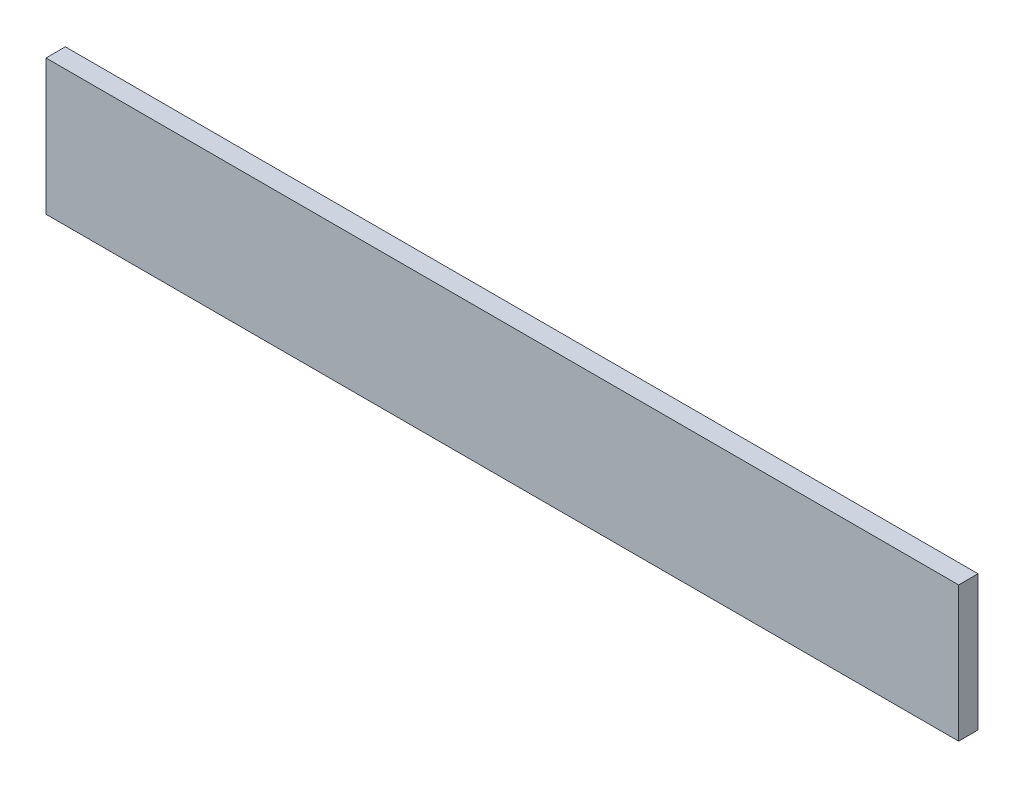
ISO-10303-21;
HEADER;
FILE_DESCRIPTION(('STEP AP214'),'2;1');
FILE_NAME('part.step','',(''),(''),'','','');
FILE_SCHEMA(('AUTOMOTIVE_DESIGN { 1 0 10303 214 1 1 1 1 }'));
ENDSEC;
DATA;
#1=APPLICATION_CONTEXT('core data for automotive mechanical design processes');
#2=APPLICATION_PROTOCOL_DEFINITION('international standard','automotive_design',2000,#1);
#3=PRODUCT_CONTEXT('',#1,'mechanical');
#4=PRODUCT('Part','Part','',(#3));
#5=PRODUCT_RELATED_PRODUCT_CATEGORY('part','',(#4));
#6=PRODUCT_DEFINITION_FORMATION('','',#4);
#7=PRODUCT_DEFINITION_CONTEXT('part definition',#1,'design');
#8=PRODUCT_DEFINITION('design','',#6,#7);
#9=PRODUCT_DEFINITION_SHAPE('','',#8);
#10=(LENGTH_UNIT() NAMED_UNIT(*) SI_UNIT(.MILLI.,.METRE.));
#11=(NAMED_UNIT(*) PLANE_ANGLE_UNIT() SI_UNIT($,.RADIAN.));
#12=(NAMED_UNIT(*) SI_UNIT($,.STERADIAN.) SOLID_ANGLE_UNIT());
#13=UNCERTAINTY_MEASURE_WITH_UNIT(LENGTH_MEASURE(1.E-05),#10,'distance_accuracy_value','');
#14=(GEOMETRIC_REPRESENTATION_CONTEXT(3) GLOBAL_UNCERTAINTY_ASSIGNED_CONTEXT((#13)) GLOBAL_UNIT_ASSIGNED_CONTEXT((#10,
#11,#12)) REPRESENTATION_CONTEXT('',''));
#15=CARTESIAN_POINT('',(0.,0.,0.));
#16=DIRECTION('',(0.,0.,1.));
#17=DIRECTION('',(1.,0.,0.));
#18=AXIS2_PLACEMENT_3D('',#15,#16,#17);
#19=CARTESIAN_POINT('',(236.,35.,-10.));
#20=DIRECTION('',(1.,0.,0.));
#21=DIRECTION('',(0.,0.,-1.));
#22=AXIS2_PLACEMENT_3D('',#19,#20,#21);
#23=PLANE('',#22);
#24=DIRECTION('',(0.,1.,0.));
#25=VECTOR('',#24,1.);
#26=CARTESIAN_POINT('',(236.,35.,0.));
#27=LINE('',#26,#25);
#28=CARTESIAN_POINT('',(236.,-35.,0.));
#29=VERTEX_POINT('',#28);
#30=CARTESIAN_POINT('',(236.,35.,0.));
#31=VERTEX_POINT('',#30);
#32=EDGE_CURVE('E102',#29,#31,#27,.T.);
#33=ORIENTED_EDGE('',*,*,#32,.F.);
#34=DIRECTION('',(0.,0.,1.));
#35=VECTOR('',#34,1.);
#36=CARTESIAN_POINT('',(236.,-35.,-10.));
#37=LINE('',#36,#35);
#38=CARTESIAN_POINT('',(236.,-35.,-10.));
#39=VERTEX_POINT('',#38);
#40=EDGE_CURVE('E11',#39,#29,#37,.T.);
#41=ORIENTED_EDGE('',*,*,#40,.F.);
#42=DIRECTION('',(0.,1.,0.));
#43=VECTOR('',#42,1.);
#44=CARTESIAN_POINT('',(236.,35.,-10.));
#45=LINE('',#44,#43);
#46=CARTESIAN_POINT('',(236.,35.,-10.));
#47=VERTEX_POINT('',#46);
#48=EDGE_CURVE('E96',#39,#47,#45,.T.);
#49=ORIENTED_EDGE('',*,*,#48,.T.);
#50=DIRECTION('',(0.,0.,1.));
#51=VECTOR('',#50,1.);
#52=CARTESIAN_POINT('',(236.,35.,-10.));
#53=LINE('',#52,#51);
#54=EDGE_CURVE('E41',#47,#31,#53,.T.);
#55=ORIENTED_EDGE('',*,*,#54,.T.);
#56=EDGE_LOOP('',(#33,#41,#49,#55));
#57=FACE_BOUND('',#56,.T.);
#58=ADVANCED_FACE('F38',(#57),#23,.T.);
#59=CARTESIAN_POINT('',(-236.,-35.,-10.));
#60=DIRECTION('',(0.,-1.,0.));
#61=DIRECTION('',(0.,0.,-1.));
#62=AXIS2_PLACEMENT_3D('',#59,#60,#61);
#63=PLANE('',#62);
#64=DIRECTION('',(1.,0.,0.));
#65=VECTOR('',#64,1.);
#66=CARTESIAN_POINT('',(-236.,-35.,0.));
#67=LINE('',#66,#65);
#68=CARTESIAN_POINT('',(-236.,-35.,0.));
#69=VERTEX_POINT('',#68);
#70=EDGE_CURVE('E98',#69,#29,#67,.T.);
#71=ORIENTED_EDGE('',*,*,#70,.F.);
#72=DIRECTION('',(0.,0.,1.));
#73=VECTOR('',#72,1.);
#74=CARTESIAN_POINT('',(-236.,-35.,-10.));
#75=LINE('',#74,#73);
#76=CARTESIAN_POINT('',(-236.,-35.,-10.));
#77=VERTEX_POINT('',#76);
#78=EDGE_CURVE('E47',#77,#69,#75,.T.);
#79=ORIENTED_EDGE('',*,*,#78,.F.);
#80=DIRECTION('',(1.,0.,0.));
#81=VECTOR('',#80,1.);
#82=CARTESIAN_POINT('',(-236.,-35.,-10.));
#83=LINE('',#82,#81);
#84=EDGE_CURVE('E93',#77,#39,#83,.T.);
#85=ORIENTED_EDGE('',*,*,#84,.T.);
#86=ORIENTED_EDGE('',*,*,#40,.T.);
#87=EDGE_LOOP('',(#71,#79,#85,#86));
#88=FACE_BOUND('',#87,.T.);
#89=ADVANCED_FACE('F112',(#88),#63,.T.);
#90=CARTESIAN_POINT('',(-236.,35.,-10.));
#91=DIRECTION('',(-1.,0.,0.));
#92=DIRECTION('',(0.,0.,1.));
#93=AXIS2_PLACEMENT_3D('',#90,#91,#92);
#94=PLANE('',#93);
#95=DIRECTION('',(0.,-1.,0.));
#96=VECTOR('',#95,1.);
#97=CARTESIAN_POINT('',(-236.,35.,0.));
#98=LINE('',#97,#96);
#99=CARTESIAN_POINT('',(-236.,35.,0.));
#100=VERTEX_POINT('',#99);
#101=EDGE_CURVE('E88',#100,#69,#98,.T.);
#102=ORIENTED_EDGE('',*,*,#101,.F.);
#103=DIRECTION('',(0.,0.,1.));
#104=VECTOR('',#103,1.);
#105=CARTESIAN_POINT('',(-236.,35.,-10.));
#106=LINE('',#105,#104);
#107=CARTESIAN_POINT('',(-236.,35.,-10.));
#108=VERTEX_POINT('',#107);
#109=EDGE_CURVE('E83',#108,#100,#106,.T.);
#110=ORIENTED_EDGE('',*,*,#109,.F.);
#111=DIRECTION('',(0.,-1.,0.));
#112=VECTOR('',#111,1.);
#113=CARTESIAN_POINT('',(-236.,35.,-10.));
#114=LINE('',#113,#112);
#115=EDGE_CURVE('E86',#108,#77,#114,.T.);
#116=ORIENTED_EDGE('',*,*,#115,.T.);
#117=ORIENTED_EDGE('',*,*,#78,.T.);
#118=EDGE_LOOP('',(#102,#110,#116,#117));
#119=FACE_BOUND('',#118,.T.);
#120=ADVANCED_FACE('F85',(#119),#94,.T.);
#121=CARTESIAN_POINT('',(-236.,35.,-10.));
#122=DIRECTION('',(0.,1.,0.));
#123=DIRECTION('',(0.,0.,1.));
#124=AXIS2_PLACEMENT_3D('',#121,#122,#123);
#125=PLANE('',#124);
#126=DIRECTION('',(-1.,0.,0.));
#127=VECTOR('',#126,1.);
#128=CARTESIAN_POINT('',(-236.,35.,0.));
#129=LINE('',#128,#127);
#130=EDGE_CURVE('E105',#31,#100,#129,.T.);
#131=ORIENTED_EDGE('',*,*,#130,.F.);
#132=ORIENTED_EDGE('',*,*,#54,.F.);
#133=DIRECTION('',(-1.,0.,0.));
#134=VECTOR('',#133,1.);
#135=CARTESIAN_POINT('',(-236.,35.,-10.));
#136=LINE('',#135,#134);
#137=EDGE_CURVE('E92',#47,#108,#136,.T.);
#138=ORIENTED_EDGE('',*,*,#137,.T.);
#139=ORIENTED_EDGE('',*,*,#109,.T.);
#140=EDGE_LOOP('',(#131,#132,#138,#139));
#141=FACE_BOUND('',#140,.T.);
#142=ADVANCED_FACE('F95',(#141),#125,.T.);
#143=CARTESIAN_POINT('',(0.,0.,-10.));
#144=DIRECTION('',(0.,0.,1.));
#145=DIRECTION('',(1.,0.,0.));
#146=AXIS2_PLACEMENT_3D('',#143,#144,#145);
#147=PLANE('',#146);
#148=ORIENTED_EDGE('',*,*,#48,.F.);
#149=ORIENTED_EDGE('',*,*,#84,.F.);
#150=ORIENTED_EDGE('',*,*,#115,.F.);
#151=ORIENTED_EDGE('',*,*,#137,.F.);
#152=EDGE_LOOP('',(#148,#149,#150,#151));
#153=FACE_BOUND('',#152,.T.);
#154=ADVANCED_FACE('F91',(#153),#147,.F.);
#155=CARTESIAN_POINT('',(0.,0.,0.));
#156=DIRECTION('',(0.,0.,1.));
#157=DIRECTION('',(1.,0.,0.));
#158=AXIS2_PLACEMENT_3D('',#155,#156,#157);
#159=PLANE('',#158);
#160=ORIENTED_EDGE('',*,*,#32,.T.);
#161=ORIENTED_EDGE('',*,*,#130,.T.);
#162=ORIENTED_EDGE('',*,*,#101,.T.);
#163=ORIENTED_EDGE('',*,*,#70,.T.);
#164=EDGE_LOOP('',(#160,#161,#162,#163));
#165=FACE_BOUND('',#164,.T.);
#166=ADVANCED_FACE('F111',(#165),#159,.T.);
#167=CLOSED_SHELL('',(#58,#89,#120,#142,#154,#166));
#168=MANIFOLD_SOLID_BREP('B2',#167);
#169=ADVANCED_BREP_SHAPE_REPRESENTATION('',(#18,#168),#14);
#170=SHAPE_DEFINITION_REPRESENTATION(#9,#169);
ENDSEC;
END-ISO-10303-21;
